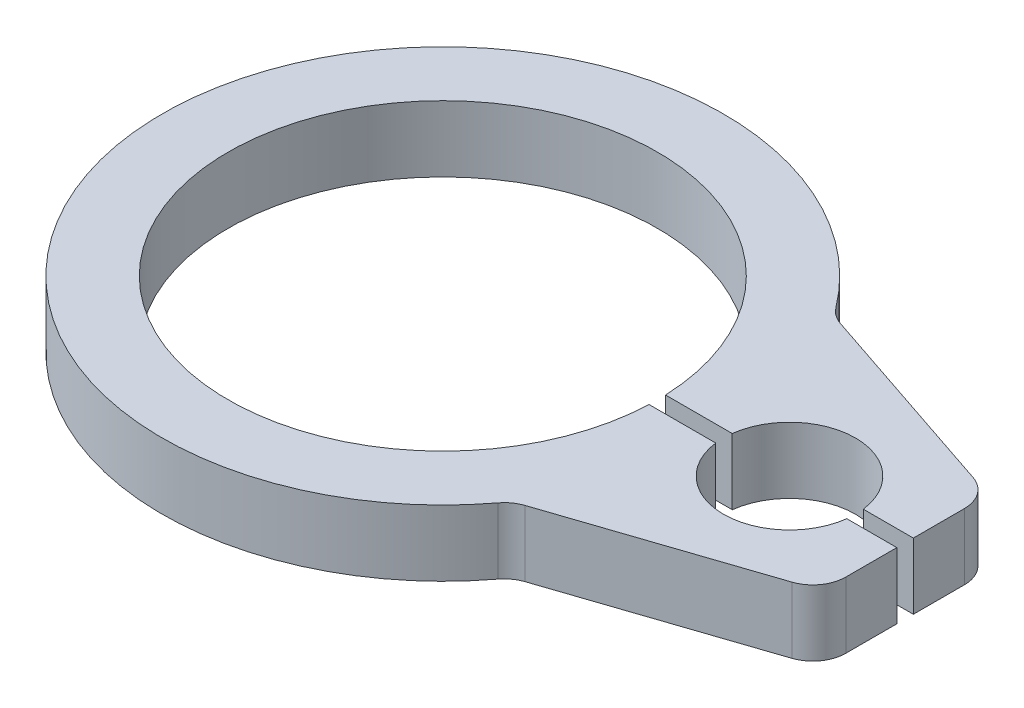
ISO-10303-21;
HEADER;
FILE_DESCRIPTION(('STEP AP214'),'2;1');
FILE_NAME('part.step','',(''),(''),'','','');
FILE_SCHEMA(('AUTOMOTIVE_DESIGN { 1 0 10303 214 1 1 1 1 }'));
ENDSEC;
DATA;
#1=APPLICATION_CONTEXT('core data for automotive mechanical design processes');
#2=APPLICATION_PROTOCOL_DEFINITION('international standard','automotive_design',2000,#1);
#3=PRODUCT_CONTEXT('',#1,'mechanical');
#4=PRODUCT('Part','Part','',(#3));
#5=PRODUCT_RELATED_PRODUCT_CATEGORY('part','',(#4));
#6=PRODUCT_DEFINITION_FORMATION('','',#4);
#7=PRODUCT_DEFINITION_CONTEXT('part definition',#1,'design');
#8=PRODUCT_DEFINITION('design','',#6,#7);
#9=PRODUCT_DEFINITION_SHAPE('','',#8);
#10=(LENGTH_UNIT() NAMED_UNIT(*) SI_UNIT(.MILLI.,.METRE.));
#11=(NAMED_UNIT(*) PLANE_ANGLE_UNIT() SI_UNIT($,.RADIAN.));
#12=(NAMED_UNIT(*) SI_UNIT($,.STERADIAN.) SOLID_ANGLE_UNIT());
#13=UNCERTAINTY_MEASURE_WITH_UNIT(LENGTH_MEASURE(1.E-05),#10,'distance_accuracy_value','');
#14=(GEOMETRIC_REPRESENTATION_CONTEXT(3) GLOBAL_UNCERTAINTY_ASSIGNED_CONTEXT((#13)) GLOBAL_UNIT_ASSIGNED_CONTEXT((#10,
#11,#12)) REPRESENTATION_CONTEXT('',''));
#15=CARTESIAN_POINT('',(0.,0.,0.));
#16=DIRECTION('',(0.,0.,1.));
#17=DIRECTION('',(1.,0.,0.));
#18=AXIS2_PLACEMENT_3D('',#15,#16,#17);
#19=CARTESIAN_POINT('',(2.1,0.4,0.));
#20=DIRECTION('',(0.,-1.,0.));
#21=DIRECTION('',(0.,0.,-1.));
#22=AXIS2_PLACEMENT_3D('',#19,#20,#21);
#23=CYLINDRICAL_SURFACE('',#22,0.4);
#24=CARTESIAN_POINT('',(2.1,0.,0.));
#25=DIRECTION('',(0.,1.,0.));
#26=DIRECTION('',(0.,0.,1.));
#27=AXIS2_PLACEMENT_3D('',#24,#25,#26);
#28=CIRCLE('',#27,0.4);
#29=CARTESIAN_POINT('',(2.49686269665969,0.,-0.05));
#30=VERTEX_POINT('',#29);
#31=CARTESIAN_POINT('',(1.70313730334031,0.,-0.05));
#32=VERTEX_POINT('',#31);
#33=EDGE_CURVE('E154',#30,#32,#28,.T.);
#34=ORIENTED_EDGE('',*,*,#33,.F.);
#35=DIRECTION('',(0.,-1.,0.));
#36=VECTOR('',#35,1.);
#37=CARTESIAN_POINT('',(2.49686269665969,0.4,-0.05));
#38=LINE('',#37,#36);
#39=CARTESIAN_POINT('',(2.49686269665969,0.4,-0.05));
#40=VERTEX_POINT('',#39);
#41=EDGE_CURVE('E149',#40,#30,#38,.T.);
#42=ORIENTED_EDGE('',*,*,#41,.F.);
#43=CARTESIAN_POINT('',(2.1,0.4,0.));
#44=DIRECTION('',(0.,1.,0.));
#45=DIRECTION('',(0.,0.,1.));
#46=AXIS2_PLACEMENT_3D('',#43,#44,#45);
#47=CIRCLE('',#46,0.4);
#48=CARTESIAN_POINT('',(1.70313730334031,0.4,-0.05));
#49=VERTEX_POINT('',#48);
#50=EDGE_CURVE('E152',#40,#49,#47,.T.);
#51=ORIENTED_EDGE('',*,*,#50,.T.);
#52=DIRECTION('',(0.,-1.,0.));
#53=VECTOR('',#52,1.);
#54=CARTESIAN_POINT('',(1.70313730334031,0.4,-0.05));
#55=LINE('',#54,#53);
#56=EDGE_CURVE('E202',#49,#32,#55,.T.);
#57=ORIENTED_EDGE('',*,*,#56,.T.);
#58=EDGE_LOOP('',(#34,#42,#51,#57));
#59=FACE_BOUND('',#58,.T.);
#60=ADVANCED_FACE('F37',(#59),#23,.F.);
#61=CARTESIAN_POINT('',(0.,0.4,-0.0499999999999996));
#62=DIRECTION('',(0.,0.,-1.));
#63=DIRECTION('',(-1.,0.,0.));
#64=AXIS2_PLACEMENT_3D('',#61,#62,#63);
#65=PLANE('',#64);
#66=DIRECTION('',(1.,0.,0.));
#67=VECTOR('',#66,1.);
#68=CARTESIAN_POINT('',(0.,0.,-0.0499999999999996));
#69=LINE('',#68,#67);
#70=CARTESIAN_POINT('',(2.8,0.,-0.0500000000000001));
#71=VERTEX_POINT('',#70);
#72=EDGE_CURVE('E204',#30,#71,#69,.T.);
#73=ORIENTED_EDGE('',*,*,#72,.T.);
#74=DIRECTION('',(0.,-1.,0.));
#75=VECTOR('',#74,1.);
#76=CARTESIAN_POINT('',(2.8,0.4,-0.0500000000000001));
#77=LINE('',#76,#75);
#78=CARTESIAN_POINT('',(2.8,0.4,-0.0500000000000001));
#79=VERTEX_POINT('',#78);
#80=EDGE_CURVE('E159',#79,#71,#77,.T.);
#81=ORIENTED_EDGE('',*,*,#80,.F.);
#82=DIRECTION('',(1.,0.,0.));
#83=VECTOR('',#82,1.);
#84=CARTESIAN_POINT('',(0.,0.4,-0.0499999999999996));
#85=LINE('',#84,#83);
#86=EDGE_CURVE('E163',#40,#79,#85,.T.);
#87=ORIENTED_EDGE('',*,*,#86,.F.);
#88=ORIENTED_EDGE('',*,*,#41,.T.);
#89=EDGE_LOOP('',(#73,#81,#87,#88));
#90=FACE_BOUND('',#89,.T.);
#91=ADVANCED_FACE('F164',(#90),#65,.F.);
#92=CARTESIAN_POINT('',(2.8,0.4,0.));
#93=DIRECTION('',(1.,0.,0.));
#94=DIRECTION('',(0.,0.,-1.));
#95=AXIS2_PLACEMENT_3D('',#92,#93,#94);
#96=PLANE('',#95);
#97=DIRECTION('',(0.,0.,1.));
#98=VECTOR('',#97,1.);
#99=CARTESIAN_POINT('',(2.8,0.,0.));
#100=LINE('',#99,#98);
#101=CARTESIAN_POINT('',(2.8,0.,-0.358996568964477));
#102=VERTEX_POINT('',#101);
#103=EDGE_CURVE('E207',#102,#71,#100,.T.);
#104=ORIENTED_EDGE('',*,*,#103,.F.);
#105=DIRECTION('',(0.,-1.,0.));
#106=VECTOR('',#105,1.);
#107=CARTESIAN_POINT('',(2.8,0.4,-0.358996568964477));
#108=LINE('',#107,#106);
#109=CARTESIAN_POINT('',(2.8,0.4,-0.358996568964477));
#110=VERTEX_POINT('',#109);
#111=EDGE_CURVE('E52',#102,#110,#108,.F.);
#112=ORIENTED_EDGE('',*,*,#111,.T.);
#113=DIRECTION('',(0.,0.,1.));
#114=VECTOR('',#113,1.);
#115=CARTESIAN_POINT('',(2.8,0.4,0.));
#116=LINE('',#115,#114);
#117=EDGE_CURVE('E167',#110,#79,#116,.T.);
#118=ORIENTED_EDGE('',*,*,#117,.T.);
#119=ORIENTED_EDGE('',*,*,#80,.T.);
#120=EDGE_LOOP('',(#104,#112,#118,#119));
#121=FACE_BOUND('',#120,.T.);
#122=ADVANCED_FACE('F292',(#121),#96,.T.);
#123=CARTESIAN_POINT('',(0.434925114486518,0.4,-1.29634023494156));
#124=DIRECTION('',(0.318077842289808,0.,-0.948064600248454));
#125=DIRECTION('',(-0.948064600248454,0.,-0.318077842289808));
#126=AXIS2_PLACEMENT_3D('',#123,#124,#125);
#127=PLANE('',#126);
#128=DIRECTION('',(0.948064600248454,0.,0.318077842289808));
#129=VECTOR('',#128,1.);
#130=CARTESIAN_POINT('',(0.434925114486518,0.,-1.29634023494156));
#131=LINE('',#130,#129);
#132=CARTESIAN_POINT('',(1.45311313077493,0.,-0.954735826147595));
#133=VERTEX_POINT('',#132);
#134=CARTESIAN_POINT('',(2.66361556845796,0.,-0.548609489014168));
#135=VERTEX_POINT('',#134);
#136=EDGE_CURVE('E209',#133,#135,#131,.T.);
#137=ORIENTED_EDGE('',*,*,#136,.F.);
#138=DIRECTION('',(0.,-1.,0.));
#139=VECTOR('',#138,1.);
#140=CARTESIAN_POINT('',(1.45311313077493,0.4,-0.954735826147595));
#141=LINE('',#140,#139);
#142=CARTESIAN_POINT('',(1.45311313077493,0.4,-0.954735826147595));
#143=VERTEX_POINT('',#142);
#144=EDGE_CURVE('E252',#133,#143,#141,.F.);
#145=ORIENTED_EDGE('',*,*,#144,.T.);
#146=DIRECTION('',(0.948064600248454,0.,0.318077842289808));
#147=VECTOR('',#146,1.);
#148=CARTESIAN_POINT('',(0.434925114486518,0.4,-1.29634023494156));
#149=LINE('',#148,#147);
#150=CARTESIAN_POINT('',(2.66361556845796,0.4,-0.548609489014168));
#151=VERTEX_POINT('',#150);
#152=EDGE_CURVE('E285',#143,#151,#149,.T.);
#153=ORIENTED_EDGE('',*,*,#152,.T.);
#154=DIRECTION('',(0.,-1.,0.));
#155=VECTOR('',#154,1.);
#156=CARTESIAN_POINT('',(2.66361556845796,0.4,-0.548609489014168));
#157=LINE('',#156,#155);
#158=EDGE_CURVE('E249',#151,#135,#157,.T.);
#159=ORIENTED_EDGE('',*,*,#158,.T.);
#160=EDGE_LOOP('',(#137,#145,#153,#159));
#161=FACE_BOUND('',#160,.T.);
#162=ADVANCED_FACE('F275',(#161),#127,.T.);
#163=CARTESIAN_POINT('',(0.,0.4,0.));
#164=DIRECTION('',(0.,-1.,0.));
#165=DIRECTION('',(0.,0.,-1.));
#166=AXIS2_PLACEMENT_3D('',#163,#164,#165);
#167=CYLINDRICAL_SURFACE('',#166,1.7);
#168=CARTESIAN_POINT('',(0.,0.,0.));
#169=DIRECTION('',(0.,1.,0.));
#170=DIRECTION('',(0.,0.,1.));
#171=AXIS2_PLACEMENT_3D('',#168,#169,#170);
#172=CIRCLE('',#171,1.7);
#173=CARTESIAN_POINT('',(1.35707304668206,0.,-1.02389098343968));
#174=VERTEX_POINT('',#173);
#175=CARTESIAN_POINT('',(1.35707304668206,0.,1.02389098343968));
#176=VERTEX_POINT('',#175);
#177=EDGE_CURVE('E211',#174,#176,#172,.T.);
#178=ORIENTED_EDGE('',*,*,#177,.T.);
#179=DIRECTION('',(0.,-1.,0.));
#180=VECTOR('',#179,1.);
#181=CARTESIAN_POINT('',(1.35707304668206,0.4,1.02389098343968));
#182=LINE('',#181,#180);
#183=CARTESIAN_POINT('',(1.35707304668206,0.4,1.02389098343968));
#184=VERTEX_POINT('',#183);
#185=EDGE_CURVE('E247',#176,#184,#182,.F.);
#186=ORIENTED_EDGE('',*,*,#185,.T.);
#187=CARTESIAN_POINT('',(0.,0.4,0.));
#188=DIRECTION('',(0.,1.,0.));
#189=DIRECTION('',(0.,0.,1.));
#190=AXIS2_PLACEMENT_3D('',#187,#188,#189);
#191=CIRCLE('',#190,1.7);
#192=CARTESIAN_POINT('',(1.35707304668206,0.4,-1.02389098343968));
#193=VERTEX_POINT('',#192);
#194=EDGE_CURVE('E283',#193,#184,#191,.T.);
#195=ORIENTED_EDGE('',*,*,#194,.F.);
#196=DIRECTION('',(0.,-1.,0.));
#197=VECTOR('',#196,1.);
#198=CARTESIAN_POINT('',(1.35707304668206,0.4,-1.02389098343968));
#199=LINE('',#198,#197);
#200=EDGE_CURVE('E244',#193,#174,#199,.T.);
#201=ORIENTED_EDGE('',*,*,#200,.T.);
#202=EDGE_LOOP('',(#178,#186,#195,#201));
#203=FACE_BOUND('',#202,.T.);
#204=ADVANCED_FACE('F287',(#203),#167,.T.);
#205=CARTESIAN_POINT('',(0.434925114486518,0.4,1.29634023494156));
#206=DIRECTION('',(-0.318077842289808,0.,-0.948064600248454));
#207=DIRECTION('',(-0.948064600248454,0.,0.318077842289808));
#208=AXIS2_PLACEMENT_3D('',#205,#206,#207);
#209=PLANE('',#208);
#210=DIRECTION('',(0.948064600248454,0.,-0.318077842289808));
#211=VECTOR('',#210,1.);
#212=CARTESIAN_POINT('',(0.434925114486518,0.4,1.29634023494156));
#213=LINE('',#212,#211);
#214=CARTESIAN_POINT('',(1.45311313077493,0.4,0.954735826147595));
#215=VERTEX_POINT('',#214);
#216=CARTESIAN_POINT('',(2.66361556845796,0.4,0.548609489014168));
#217=VERTEX_POINT('',#216);
#218=EDGE_CURVE('E195',#215,#217,#213,.T.);
#219=ORIENTED_EDGE('',*,*,#218,.F.);
#220=DIRECTION('',(0.,1.,0.));
#221=VECTOR('',#220,1.);
#222=CARTESIAN_POINT('',(1.45311313077493,0.,0.954735826147595));
#223=LINE('',#222,#221);
#224=CARTESIAN_POINT('',(1.45311313077493,0.,0.954735826147595));
#225=VERTEX_POINT('',#224);
#226=EDGE_CURVE('E241',#215,#225,#223,.F.);
#227=ORIENTED_EDGE('',*,*,#226,.T.);
#228=DIRECTION('',(0.948064600248454,0.,-0.318077842289808));
#229=VECTOR('',#228,1.);
#230=CARTESIAN_POINT('',(0.434925114486518,0.,1.29634023494156));
#231=LINE('',#230,#229);
#232=CARTESIAN_POINT('',(2.66361556845796,0.,0.548609489014168));
#233=VERTEX_POINT('',#232);
#234=EDGE_CURVE('E214',#225,#233,#231,.T.);
#235=ORIENTED_EDGE('',*,*,#234,.T.);
#236=DIRECTION('',(0.,-1.,0.));
#237=VECTOR('',#236,1.);
#238=CARTESIAN_POINT('',(2.66361556845796,0.4,0.548609489014168));
#239=LINE('',#238,#237);
#240=EDGE_CURVE('E158',#233,#217,#239,.F.);
#241=ORIENTED_EDGE('',*,*,#240,.T.);
#242=EDGE_LOOP('',(#219,#227,#235,#241));
#243=FACE_BOUND('',#242,.T.);
#244=ADVANCED_FACE('F357',(#243),#209,.F.);
#245=CARTESIAN_POINT('',(2.8,0.4,0.));
#246=DIRECTION('',(1.,0.,0.));
#247=DIRECTION('',(0.,0.,-1.));
#248=AXIS2_PLACEMENT_3D('',#245,#246,#247);
#249=PLANE('',#248);
#250=DIRECTION('',(0.,0.,1.));
#251=VECTOR('',#250,1.);
#252=CARTESIAN_POINT('',(2.8,0.4,0.));
#253=LINE('',#252,#251);
#254=CARTESIAN_POINT('',(2.8,0.4,0.0499999999999999));
#255=VERTEX_POINT('',#254);
#256=CARTESIAN_POINT('',(2.8,0.4,0.358996568964477));
#257=VERTEX_POINT('',#256);
#258=EDGE_CURVE('E190',#255,#257,#253,.T.);
#259=ORIENTED_EDGE('',*,*,#258,.T.);
#260=DIRECTION('',(0.,-1.,0.));
#261=VECTOR('',#260,1.);
#262=CARTESIAN_POINT('',(2.8,0.,0.358996568964477));
#263=LINE('',#262,#261);
#264=CARTESIAN_POINT('',(2.8,0.,0.358996568964477));
#265=VERTEX_POINT('',#264);
#266=EDGE_CURVE('E254',#257,#265,#263,.T.);
#267=ORIENTED_EDGE('',*,*,#266,.T.);
#268=DIRECTION('',(0.,0.,1.));
#269=VECTOR('',#268,1.);
#270=CARTESIAN_POINT('',(2.8,0.,0.));
#271=LINE('',#270,#269);
#272=CARTESIAN_POINT('',(2.8,0.,0.0499999999999999));
#273=VERTEX_POINT('',#272);
#274=EDGE_CURVE('E217',#273,#265,#271,.T.);
#275=ORIENTED_EDGE('',*,*,#274,.F.);
#276=DIRECTION('',(0.,-1.,0.));
#277=VECTOR('',#276,1.);
#278=CARTESIAN_POINT('',(2.8,0.4,0.0499999999999999));
#279=LINE('',#278,#277);
#280=EDGE_CURVE('E237',#255,#273,#279,.T.);
#281=ORIENTED_EDGE('',*,*,#280,.F.);
#282=EDGE_LOOP('',(#259,#267,#275,#281));
#283=FACE_BOUND('',#282,.T.);
#284=ADVANCED_FACE('F319',(#283),#249,.T.);
#285=CARTESIAN_POINT('',(0.,0.4,0.0500000000000004));
#286=DIRECTION('',(0.,0.,-1.));
#287=DIRECTION('',(-1.,0.,0.));
#288=AXIS2_PLACEMENT_3D('',#285,#286,#287);
#289=PLANE('',#288);
#290=DIRECTION('',(1.,0.,0.));
#291=VECTOR('',#290,1.);
#292=CARTESIAN_POINT('',(0.,0.,0.0500000000000004));
#293=LINE('',#292,#291);
#294=CARTESIAN_POINT('',(2.49686269665969,0.,0.05));
#295=VERTEX_POINT('',#294);
#296=EDGE_CURVE('E220',#295,#273,#293,.T.);
#297=ORIENTED_EDGE('',*,*,#296,.F.);
#298=DIRECTION('',(0.,-1.,0.));
#299=VECTOR('',#298,1.);
#300=CARTESIAN_POINT('',(2.49686269665969,0.4,0.05));
#301=LINE('',#300,#299);
#302=CARTESIAN_POINT('',(2.49686269665969,0.4,0.05));
#303=VERTEX_POINT('',#302);
#304=EDGE_CURVE('E235',#303,#295,#301,.T.);
#305=ORIENTED_EDGE('',*,*,#304,.F.);
#306=DIRECTION('',(1.,0.,0.));
#307=VECTOR('',#306,1.);
#308=CARTESIAN_POINT('',(0.,0.4,0.0500000000000004));
#309=LINE('',#308,#307);
#310=EDGE_CURVE('E183',#303,#255,#309,.T.);
#311=ORIENTED_EDGE('',*,*,#310,.T.);
#312=ORIENTED_EDGE('',*,*,#280,.T.);
#313=EDGE_LOOP('',(#297,#305,#311,#312));
#314=FACE_BOUND('',#313,.T.);
#315=ADVANCED_FACE('F312',(#314),#289,.T.);
#316=CARTESIAN_POINT('',(1.70313730334031,0.,0.05));
#317=VERTEX_POINT('',#316);
#318=EDGE_CURVE('E205',#317,#295,#28,.T.);
#319=ORIENTED_EDGE('',*,*,#318,.F.);
#320=DIRECTION('',(0.,-1.,0.));
#321=VECTOR('',#320,1.);
#322=CARTESIAN_POINT('',(1.70313730334031,0.4,0.05));
#323=LINE('',#322,#321);
#324=CARTESIAN_POINT('',(1.70313730334031,0.4,0.05));
#325=VERTEX_POINT('',#324);
#326=EDGE_CURVE('E233',#325,#317,#323,.T.);
#327=ORIENTED_EDGE('',*,*,#326,.F.);
#328=EDGE_CURVE('E177',#325,#303,#47,.T.);
#329=ORIENTED_EDGE('',*,*,#328,.T.);
#330=ORIENTED_EDGE('',*,*,#304,.T.);
#331=EDGE_LOOP('',(#319,#327,#329,#330));
#332=FACE_BOUND('',#331,.T.);
#333=ADVANCED_FACE('F303',(#332),#23,.F.);
#334=CARTESIAN_POINT('',(0.,0.4,0.05));
#335=DIRECTION('',(0.,0.,-1.));
#336=DIRECTION('',(-1.,0.,0.));
#337=AXIS2_PLACEMENT_3D('',#334,#335,#336);
#338=PLANE('',#337);
#339=DIRECTION('',(1.,0.,0.));
#340=VECTOR('',#339,1.);
#341=CARTESIAN_POINT('',(0.,0.,0.05));
#342=LINE('',#341,#340);
#343=CARTESIAN_POINT('',(1.29903810567666,0.,0.05));
#344=VERTEX_POINT('',#343);
#345=EDGE_CURVE('E223',#344,#317,#342,.T.);
#346=ORIENTED_EDGE('',*,*,#345,.F.);
#347=DIRECTION('',(0.,-1.,0.));
#348=VECTOR('',#347,1.);
#349=CARTESIAN_POINT('',(1.29903810567666,0.4,0.05));
#350=LINE('',#349,#348);
#351=CARTESIAN_POINT('',(1.29903810567666,0.4,0.05));
#352=VERTEX_POINT('',#351);
#353=EDGE_CURVE('E231',#352,#344,#350,.T.);
#354=ORIENTED_EDGE('',*,*,#353,.F.);
#355=DIRECTION('',(1.,0.,0.));
#356=VECTOR('',#355,1.);
#357=CARTESIAN_POINT('',(0.,0.4,0.05));
#358=LINE('',#357,#356);
#359=EDGE_CURVE('E182',#352,#325,#358,.T.);
#360=ORIENTED_EDGE('',*,*,#359,.T.);
#361=ORIENTED_EDGE('',*,*,#326,.T.);
#362=EDGE_LOOP('',(#346,#354,#360,#361));
#363=FACE_BOUND('',#362,.T.);
#364=ADVANCED_FACE('F311',(#363),#338,.T.);
#365=CARTESIAN_POINT('',(0.,0.4,0.));
#366=DIRECTION('',(0.,-1.,0.));
#367=DIRECTION('',(0.,0.,-1.));
#368=AXIS2_PLACEMENT_3D('',#365,#366,#367);
#369=CYLINDRICAL_SURFACE('',#368,1.3);
#370=CARTESIAN_POINT('',(0.,0.,0.));
#371=DIRECTION('',(0.,1.,0.));
#372=DIRECTION('',(0.,0.,1.));
#373=AXIS2_PLACEMENT_3D('',#370,#371,#372);
#374=CIRCLE('',#373,1.3);
#375=CARTESIAN_POINT('',(1.29903810567666,0.,-0.05));
#376=VERTEX_POINT('',#375);
#377=EDGE_CURVE('E179',#376,#344,#374,.T.);
#378=ORIENTED_EDGE('',*,*,#377,.F.);
#379=DIRECTION('',(0.,-1.,0.));
#380=VECTOR('',#379,1.);
#381=CARTESIAN_POINT('',(1.29903810567666,0.4,-0.05));
#382=LINE('',#381,#380);
#383=CARTESIAN_POINT('',(1.29903810567666,0.4,-0.05));
#384=VERTEX_POINT('',#383);
#385=EDGE_CURVE('E229',#384,#376,#382,.T.);
#386=ORIENTED_EDGE('',*,*,#385,.F.);
#387=CARTESIAN_POINT('',(0.,0.4,0.));
#388=DIRECTION('',(0.,1.,0.));
#389=DIRECTION('',(0.,0.,1.));
#390=AXIS2_PLACEMENT_3D('',#387,#388,#389);
#391=CIRCLE('',#390,1.3);
#392=EDGE_CURVE('E187',#384,#352,#391,.T.);
#393=ORIENTED_EDGE('',*,*,#392,.T.);
#394=ORIENTED_EDGE('',*,*,#353,.T.);
#395=EDGE_LOOP('',(#378,#386,#393,#394));
#396=FACE_BOUND('',#395,.T.);
#397=ADVANCED_FACE('F317',(#396),#369,.F.);
#398=CARTESIAN_POINT('',(0.,0.4,-0.05));
#399=DIRECTION('',(0.,0.,-1.));
#400=DIRECTION('',(-1.,0.,0.));
#401=AXIS2_PLACEMENT_3D('',#398,#399,#400);
#402=PLANE('',#401);
#403=DIRECTION('',(1.,0.,0.));
#404=VECTOR('',#403,1.);
#405=CARTESIAN_POINT('',(0.,0.,-0.05));
#406=LINE('',#405,#404);
#407=EDGE_CURVE('E175',#376,#32,#406,.T.);
#408=ORIENTED_EDGE('',*,*,#407,.T.);
#409=ORIENTED_EDGE('',*,*,#56,.F.);
#410=DIRECTION('',(1.,0.,0.));
#411=VECTOR('',#410,1.);
#412=CARTESIAN_POINT('',(0.,0.4,-0.05));
#413=LINE('',#412,#411);
#414=EDGE_CURVE('E173',#384,#49,#413,.T.);
#415=ORIENTED_EDGE('',*,*,#414,.F.);
#416=ORIENTED_EDGE('',*,*,#385,.T.);
#417=EDGE_LOOP('',(#408,#409,#415,#416));
#418=FACE_BOUND('',#417,.T.);
#419=ADVANCED_FACE('F329',(#418),#402,.F.);
#420=CARTESIAN_POINT('',(0.,0.4,0.));
#421=DIRECTION('',(0.,1.,0.));
#422=DIRECTION('',(0.,0.,1.));
#423=AXIS2_PLACEMENT_3D('',#420,#421,#422);
#424=PLANE('',#423);
#425=ORIENTED_EDGE('',*,*,#218,.T.);
#426=CARTESIAN_POINT('',(2.6,0.4,0.358996568964477));
#427=DIRECTION('',(0.,1.,0.));
#428=DIRECTION('',(0.,0.,1.));
#429=AXIS2_PLACEMENT_3D('',#426,#427,#428);
#430=CIRCLE('',#429,0.2);
#431=EDGE_CURVE('E262',#217,#257,#430,.T.);
#432=ORIENTED_EDGE('',*,*,#431,.T.);
#433=ORIENTED_EDGE('',*,*,#258,.F.);
#434=ORIENTED_EDGE('',*,*,#310,.F.);
#435=ORIENTED_EDGE('',*,*,#328,.F.);
#436=ORIENTED_EDGE('',*,*,#359,.F.);
#437=ORIENTED_EDGE('',*,*,#392,.F.);
#438=ORIENTED_EDGE('',*,*,#414,.T.);
#439=ORIENTED_EDGE('',*,*,#50,.F.);
#440=ORIENTED_EDGE('',*,*,#86,.T.);
#441=ORIENTED_EDGE('',*,*,#117,.F.);
#442=CARTESIAN_POINT('',(2.6,0.4,-0.358996568964477));
#443=DIRECTION('',(0.,1.,0.));
#444=DIRECTION('',(0.,0.,1.));
#445=AXIS2_PLACEMENT_3D('',#442,#443,#444);
#446=CIRCLE('',#445,0.2);
#447=EDGE_CURVE('E260',#110,#151,#446,.T.);
#448=ORIENTED_EDGE('',*,*,#447,.T.);
#449=ORIENTED_EDGE('',*,*,#152,.F.);
#450=CARTESIAN_POINT('',(1.51672869923289,0.4,-1.14434874619729));
#451=DIRECTION('',(0.,1.,0.));
#452=DIRECTION('',(0.,0.,1.));
#453=AXIS2_PLACEMENT_3D('',#450,#451,#452);
#454=CIRCLE('',#453,0.2);
#455=EDGE_CURVE('E11',#143,#193,#454,.F.);
#456=ORIENTED_EDGE('',*,*,#455,.T.);
#457=ORIENTED_EDGE('',*,*,#194,.T.);
#458=CARTESIAN_POINT('',(1.51672869923289,0.4,1.14434874619729));
#459=DIRECTION('',(0.,1.,0.));
#460=DIRECTION('',(0.,0.,1.));
#461=AXIS2_PLACEMENT_3D('',#458,#459,#460);
#462=CIRCLE('',#461,0.2);
#463=EDGE_CURVE('E267',#184,#215,#462,.F.);
#464=ORIENTED_EDGE('',*,*,#463,.T.);
#465=EDGE_LOOP('',(#425,#432,#433,#434,#435,#436,#437,#438,#439,#440,#441,#448,#449,#456,#457,#464));
#466=FACE_BOUND('',#465,.T.);
#467=ADVANCED_FACE('F170',(#466),#424,.T.);
#468=CARTESIAN_POINT('',(0.,0.,0.));
#469=DIRECTION('',(0.,1.,0.));
#470=DIRECTION('',(0.,0.,1.));
#471=AXIS2_PLACEMENT_3D('',#468,#469,#470);
#472=PLANE('',#471);
#473=ORIENTED_EDGE('',*,*,#274,.T.);
#474=CARTESIAN_POINT('',(2.6,0.,0.358996568964477));
#475=DIRECTION('',(0.,1.,0.));
#476=DIRECTION('',(0.,0.,1.));
#477=AXIS2_PLACEMENT_3D('',#474,#475,#476);
#478=CIRCLE('',#477,0.2);
#479=EDGE_CURVE('E258',#265,#233,#478,.F.);
#480=ORIENTED_EDGE('',*,*,#479,.T.);
#481=ORIENTED_EDGE('',*,*,#234,.F.);
#482=CARTESIAN_POINT('',(1.51672869923289,0.,1.14434874619729));
#483=DIRECTION('',(0.,1.,0.));
#484=DIRECTION('',(0.,0.,1.));
#485=AXIS2_PLACEMENT_3D('',#482,#483,#484);
#486=CIRCLE('',#485,0.2);
#487=EDGE_CURVE('E265',#225,#176,#486,.T.);
#488=ORIENTED_EDGE('',*,*,#487,.T.);
#489=ORIENTED_EDGE('',*,*,#177,.F.);
#490=CARTESIAN_POINT('',(1.51672869923289,0.,-1.14434874619729));
#491=DIRECTION('',(0.,1.,0.));
#492=DIRECTION('',(0.,0.,1.));
#493=AXIS2_PLACEMENT_3D('',#490,#491,#492);
#494=CIRCLE('',#493,0.2);
#495=EDGE_CURVE('E45',#174,#133,#494,.T.);
#496=ORIENTED_EDGE('',*,*,#495,.T.);
#497=ORIENTED_EDGE('',*,*,#136,.T.);
#498=CARTESIAN_POINT('',(2.6,0.,-0.358996568964477));
#499=DIRECTION('',(0.,1.,0.));
#500=DIRECTION('',(0.,0.,1.));
#501=AXIS2_PLACEMENT_3D('',#498,#499,#500);
#502=CIRCLE('',#501,0.2);
#503=EDGE_CURVE('E60',#135,#102,#502,.F.);
#504=ORIENTED_EDGE('',*,*,#503,.T.);
#505=ORIENTED_EDGE('',*,*,#103,.T.);
#506=ORIENTED_EDGE('',*,*,#72,.F.);
#507=ORIENTED_EDGE('',*,*,#33,.T.);
#508=ORIENTED_EDGE('',*,*,#407,.F.);
#509=ORIENTED_EDGE('',*,*,#377,.T.);
#510=ORIENTED_EDGE('',*,*,#345,.T.);
#511=ORIENTED_EDGE('',*,*,#318,.T.);
#512=ORIENTED_EDGE('',*,*,#296,.T.);
#513=EDGE_LOOP('',(#473,#480,#481,#488,#489,#496,#497,#504,#505,#506,#507,#508,#509,#510,#511,#512));
#514=FACE_BOUND('',#513,.T.);
#515=ADVANCED_FACE('F270',(#514),#472,.F.);
#516=CARTESIAN_POINT('',(1.51672869923289,0.4,1.14434874619729));
#517=DIRECTION('',(0.,-1.,0.));
#518=DIRECTION('',(0.,0.,-1.));
#519=AXIS2_PLACEMENT_3D('',#516,#517,#518);
#520=CYLINDRICAL_SURFACE('',#519,0.2);
#521=ORIENTED_EDGE('',*,*,#463,.F.);
#522=ORIENTED_EDGE('',*,*,#185,.F.);
#523=ORIENTED_EDGE('',*,*,#487,.F.);
#524=ORIENTED_EDGE('',*,*,#226,.F.);
#525=EDGE_LOOP('',(#521,#522,#523,#524));
#526=FACE_BOUND('',#525,.T.);
#527=ADVANCED_FACE('F340',(#526),#520,.F.);
#528=CARTESIAN_POINT('',(1.51672869923289,0.4,-1.14434874619729));
#529=DIRECTION('',(0.,-1.,0.));
#530=DIRECTION('',(0.,0.,-1.));
#531=AXIS2_PLACEMENT_3D('',#528,#529,#530);
#532=CYLINDRICAL_SURFACE('',#531,0.2);
#533=ORIENTED_EDGE('',*,*,#455,.F.);
#534=ORIENTED_EDGE('',*,*,#144,.F.);
#535=ORIENTED_EDGE('',*,*,#495,.F.);
#536=ORIENTED_EDGE('',*,*,#200,.F.);
#537=EDGE_LOOP('',(#533,#534,#535,#536));
#538=FACE_BOUND('',#537,.T.);
#539=ADVANCED_FACE('F280',(#538),#532,.F.);
#540=CARTESIAN_POINT('',(2.6,0.4,0.358996568964477));
#541=DIRECTION('',(0.,1.,0.));
#542=DIRECTION('',(0.,0.,1.));
#543=AXIS2_PLACEMENT_3D('',#540,#541,#542);
#544=CYLINDRICAL_SURFACE('',#543,0.2);
#545=ORIENTED_EDGE('',*,*,#431,.F.);
#546=ORIENTED_EDGE('',*,*,#240,.F.);
#547=ORIENTED_EDGE('',*,*,#479,.F.);
#548=ORIENTED_EDGE('',*,*,#266,.F.);
#549=EDGE_LOOP('',(#545,#546,#547,#548));
#550=FACE_BOUND('',#549,.T.);
#551=ADVANCED_FACE('F296',(#550),#544,.T.);
#552=CARTESIAN_POINT('',(2.6,0.4,-0.358996568964477));
#553=DIRECTION('',(0.,-1.,0.));
#554=DIRECTION('',(0.,0.,-1.));
#555=AXIS2_PLACEMENT_3D('',#552,#553,#554);
#556=CYLINDRICAL_SURFACE('',#555,0.2);
#557=ORIENTED_EDGE('',*,*,#447,.F.);
#558=ORIENTED_EDGE('',*,*,#111,.F.);
#559=ORIENTED_EDGE('',*,*,#503,.F.);
#560=ORIENTED_EDGE('',*,*,#158,.F.);
#561=EDGE_LOOP('',(#557,#558,#559,#560));
#562=FACE_BOUND('',#561,.T.);
#563=ADVANCED_FACE('F39',(#562),#556,.T.);
#564=CLOSED_SHELL('',(#60,#91,#122,#162,#204,#244,#284,#315,#333,#364,#397,#419,#467,#515,#527,
#539,#551,#563));
#565=MANIFOLD_SOLID_BREP('B2',#564);
#566=ADVANCED_BREP_SHAPE_REPRESENTATION('',(#18,#565),#14);
#567=SHAPE_DEFINITION_REPRESENTATION(#9,#566);
ENDSEC;
END-ISO-10303-21;
